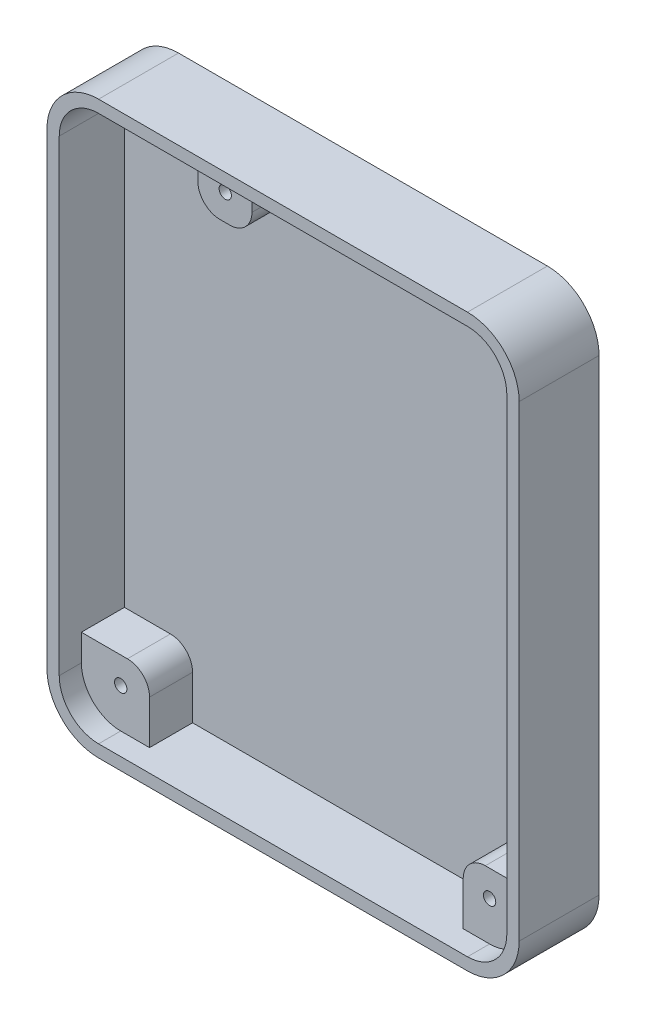
ISO-10303-21;
HEADER;
FILE_DESCRIPTION(('STEP AP214'),'2;1');
FILE_NAME('part.step','',(''),(''),'','','');
FILE_SCHEMA(('AUTOMOTIVE_DESIGN { 1 0 10303 214 1 1 1 1 }'));
ENDSEC;
DATA;
#1=APPLICATION_CONTEXT('core data for automotive mechanical design processes');
#2=APPLICATION_PROTOCOL_DEFINITION('international standard','automotive_design',2000,#1);
#3=PRODUCT_CONTEXT('',#1,'mechanical');
#4=PRODUCT('Part','Part','',(#3));
#5=PRODUCT_RELATED_PRODUCT_CATEGORY('part','',(#4));
#6=PRODUCT_DEFINITION_FORMATION('','',#4);
#7=PRODUCT_DEFINITION_CONTEXT('part definition',#1,'design');
#8=PRODUCT_DEFINITION('design','',#6,#7);
#9=PRODUCT_DEFINITION_SHAPE('','',#8);
#10=(LENGTH_UNIT() NAMED_UNIT(*) SI_UNIT(.MILLI.,.METRE.));
#11=(NAMED_UNIT(*) PLANE_ANGLE_UNIT() SI_UNIT($,.RADIAN.));
#12=(NAMED_UNIT(*) SI_UNIT($,.STERADIAN.) SOLID_ANGLE_UNIT());
#13=UNCERTAINTY_MEASURE_WITH_UNIT(LENGTH_MEASURE(1.E-05),#10,'distance_accuracy_value','');
#14=(GEOMETRIC_REPRESENTATION_CONTEXT(3) GLOBAL_UNCERTAINTY_ASSIGNED_CONTEXT((#13)) GLOBAL_UNIT_ASSIGNED_CONTEXT((#10,
#11,#12)) REPRESENTATION_CONTEXT('',''));
#15=CARTESIAN_POINT('',(0.,0.,0.));
#16=DIRECTION('',(0.,0.,1.));
#17=DIRECTION('',(1.,0.,0.));
#18=AXIS2_PLACEMENT_3D('',#15,#16,#17);
#19=CARTESIAN_POINT('',(3.00000178933324,44.2000008999999,6.5));
#20=DIRECTION('',(0.,-1.,0.));
#21=DIRECTION('',(1.,0.,0.));
#22=AXIS2_PLACEMENT_3D('',#19,#20,#21);
#23=PLANE('',#22);
#24=DIRECTION('',(-1.,0.,0.));
#25=VECTOR('',#24,1.);
#26=CARTESIAN_POINT('',(3.00000178933324,44.2000008999999,1.2));
#27=LINE('',#26,#25);
#28=CARTESIAN_POINT('',(9.27121903146132,44.2000009000005,1.2));
#29=VERTEX_POINT('',#28);
#30=CARTESIAN_POINT('',(3.00000178933324,44.2000008999999,1.2));
#31=VERTEX_POINT('',#30);
#32=EDGE_CURVE('E333',#29,#31,#27,.T.);
#33=ORIENTED_EDGE('',*,*,#32,.F.);
#34=DIRECTION('',(0.,0.,-1.));
#35=VECTOR('',#34,1.);
#36=CARTESIAN_POINT('',(9.27121903146132,44.2000009000005,4.7));
#37=LINE('',#36,#35);
#38=CARTESIAN_POINT('',(9.27121903146132,44.2000009000005,4.7));
#39=VERTEX_POINT('',#38);
#40=EDGE_CURVE('E552',#39,#29,#37,.T.);
#41=ORIENTED_EDGE('',*,*,#40,.F.);
#42=DIRECTION('',(-1.,0.,0.));
#43=VECTOR('',#42,1.);
#44=CARTESIAN_POINT('',(9.27121903146132,44.2000009000005,4.7));
#45=LINE('',#44,#43);
#46=CARTESIAN_POINT('',(13.6696035758649,44.2000009000005,4.7));
#47=VERTEX_POINT('',#46);
#48=EDGE_CURVE('E550',#47,#39,#45,.T.);
#49=ORIENTED_EDGE('',*,*,#48,.F.);
#50=DIRECTION('',(0.,0.,-1.));
#51=VECTOR('',#50,1.);
#52=CARTESIAN_POINT('',(13.6696035758649,44.2000009000005,4.7));
#53=LINE('',#52,#51);
#54=CARTESIAN_POINT('',(13.6696035758649,44.2000009000005,1.2));
#55=VERTEX_POINT('',#54);
#56=EDGE_CURVE('E564',#47,#55,#53,.T.);
#57=ORIENTED_EDGE('',*,*,#56,.T.);
#58=CARTESIAN_POINT('',(33.00000004,44.2000009000005,1.2));
#59=VERTEX_POINT('',#58);
#60=EDGE_CURVE('E334',#59,#55,#27,.T.);
#61=ORIENTED_EDGE('',*,*,#60,.F.);
#62=DIRECTION('',(0.,0.,-1.));
#63=VECTOR('',#62,1.);
#64=CARTESIAN_POINT('',(33.00000004,44.2000009000005,6.5));
#65=LINE('',#64,#63);
#66=CARTESIAN_POINT('',(33.00000004,44.2000009000005,6.5));
#67=VERTEX_POINT('',#66);
#68=EDGE_CURVE('E264',#67,#59,#65,.T.);
#69=ORIENTED_EDGE('',*,*,#68,.F.);
#70=DIRECTION('',(-1.,0.,0.));
#71=VECTOR('',#70,1.);
#72=CARTESIAN_POINT('',(3.00000178933324,44.2000008999999,6.5));
#73=LINE('',#72,#71);
#74=CARTESIAN_POINT('',(3.00000178933324,44.2000008999999,6.5));
#75=VERTEX_POINT('',#74);
#76=EDGE_CURVE('E484',#67,#75,#73,.T.);
#77=ORIENTED_EDGE('',*,*,#76,.T.);
#78=DIRECTION('',(0.,0.,-1.));
#79=VECTOR('',#78,1.);
#80=CARTESIAN_POINT('',(3.00000178933324,44.2000008999999,6.5));
#81=LINE('',#80,#79);
#82=EDGE_CURVE('E486',#75,#31,#81,.T.);
#83=ORIENTED_EDGE('',*,*,#82,.T.);
#84=EDGE_LOOP('',(#33,#41,#49,#57,#61,#69,#77,#83));
#85=FACE_BOUND('',#84,.T.);
#86=ADVANCED_FACE('F33',(#85),#23,.T.);
#87=CARTESIAN_POINT('',(2.99999908,40.99999928,6.5));
#88=DIRECTION('',(0.,0.,1.));
#89=DIRECTION('',(1.,0.,0.));
#90=AXIS2_PLACEMENT_3D('',#87,#88,#89);
#91=PLANE('',#90);
#92=CARTESIAN_POINT('',(2.99999908,40.99999928,6.5));
#93=DIRECTION('',(0.,0.,1.));
#94=DIRECTION('',(1.,0.,0.));
#95=AXIS2_PLACEMENT_3D('',#92,#93,#94);
#96=CIRCLE('',#95,4.2000016200008);
#97=CARTESIAN_POINT('',(3.00000178933324,45.2000008999999,6.5));
#98=VERTEX_POINT('',#97);
#99=CARTESIAN_POINT('',(-1.20000253999993,40.9999965706668,6.5));
#100=VERTEX_POINT('',#99);
#101=EDGE_CURVE('E277',#98,#100,#96,.T.);
#102=ORIENTED_EDGE('',*,*,#101,.T.);
#103=DIRECTION('',(0.,-1.,0.));
#104=VECTOR('',#103,1.);
#105=CARTESIAN_POINT('',(-1.20000253999993,40.9999965706668,6.5));
#106=LINE('',#105,#104);
#107=CARTESIAN_POINT('',(-1.20000253999974,3.00000517599945,6.5));
#108=VERTEX_POINT('',#107);
#109=EDGE_CURVE('E280',#100,#108,#106,.T.);
#110=ORIENTED_EDGE('',*,*,#109,.T.);
#111=CARTESIAN_POINT('',(2.99999908,3.00000162,6.5));
#112=DIRECTION('',(0.,0.,1.));
#113=DIRECTION('',(1.,0.,0.));
#114=AXIS2_PLACEMENT_3D('',#111,#112,#113);
#115=CIRCLE('',#114,4.20000162000124);
#116=CARTESIAN_POINT('',(3.00000178933324,-1.20000000000054,6.5));
#117=VERTEX_POINT('',#116);
#118=EDGE_CURVE('E283',#108,#117,#115,.T.);
#119=ORIENTED_EDGE('',*,*,#118,.T.);
#120=DIRECTION('',(1.,0.,0.));
#121=VECTOR('',#120,1.);
#122=CARTESIAN_POINT('',(3.00000178933324,-1.20000000000054,6.5));
#123=LINE('',#122,#121);
#124=CARTESIAN_POINT('',(33.00000004,-1.2000000000004,6.5));
#125=VERTEX_POINT('',#124);
#126=EDGE_CURVE('E285',#117,#125,#123,.T.);
#127=ORIENTED_EDGE('',*,*,#126,.T.);
#128=CARTESIAN_POINT('',(33.00000004,3.00000162,6.5));
#129=DIRECTION('',(0.,0.,1.));
#130=DIRECTION('',(1.,0.,0.));
#131=AXIS2_PLACEMENT_3D('',#128,#129,#130);
#132=CIRCLE('',#131,4.2000016200004);
#133=CARTESIAN_POINT('',(37.2000016599994,3.00000432933324,6.5));
#134=VERTEX_POINT('',#133);
#135=EDGE_CURVE('E287',#125,#134,#132,.T.);
#136=ORIENTED_EDGE('',*,*,#135,.T.);
#137=DIRECTION('',(0.,1.,0.));
#138=VECTOR('',#137,1.);
#139=CARTESIAN_POINT('',(37.200001659999,40.9999957240005,6.5));
#140=LINE('',#139,#138);
#141=CARTESIAN_POINT('',(37.2000016599987,40.9999957240005,6.5));
#142=VERTEX_POINT('',#141);
#143=EDGE_CURVE('E289',#134,#142,#140,.T.);
#144=ORIENTED_EDGE('',*,*,#143,.T.);
#145=CARTESIAN_POINT('',(33.00000004,40.99999928,6.5));
#146=DIRECTION('',(0.,0.,1.));
#147=DIRECTION('',(1.,0.,0.));
#148=AXIS2_PLACEMENT_3D('',#145,#146,#147);
#149=CIRCLE('',#148,4.20000162000023);
#150=CARTESIAN_POINT('',(33.00000004,45.2000008999999,6.5));
#151=VERTEX_POINT('',#150);
#152=EDGE_CURVE('E291',#142,#151,#149,.T.);
#153=ORIENTED_EDGE('',*,*,#152,.T.);
#154=DIRECTION('',(-1.,0.,0.));
#155=VECTOR('',#154,1.);
#156=CARTESIAN_POINT('',(3.00000178933324,45.2000008999999,6.5));
#157=LINE('',#156,#155);
#158=EDGE_CURVE('E293',#151,#98,#157,.T.);
#159=ORIENTED_EDGE('',*,*,#158,.T.);
#160=EDGE_LOOP('',(#102,#110,#119,#127,#136,#144,#153,#159));
#161=FACE_BOUND('',#160,.T.);
#162=DIRECTION('',(0.,-1.,0.));
#163=VECTOR('',#162,1.);
#164=CARTESIAN_POINT('',(-0.200002539999926,40.9999965706668,6.5));
#165=LINE('',#164,#163);
#166=CARTESIAN_POINT('',(-0.200002539999926,40.9999965706668,6.5));
#167=VERTEX_POINT('',#166);
#168=CARTESIAN_POINT('',(-0.200002539999929,3.00000432933324,6.5));
#169=VERTEX_POINT('',#168);
#170=EDGE_CURVE('E463',#167,#169,#165,.T.);
#171=ORIENTED_EDGE('',*,*,#170,.F.);
#172=CARTESIAN_POINT('',(2.99999908,40.99999928,6.5));
#173=DIRECTION('',(0.,0.,1.));
#174=DIRECTION('',(1.,0.,0.));
#175=AXIS2_PLACEMENT_3D('',#172,#173,#174);
#176=CIRCLE('',#175,3.20000162000107);
#177=EDGE_CURVE('E465',#75,#167,#176,.T.);
#178=ORIENTED_EDGE('',*,*,#177,.F.);
#179=ORIENTED_EDGE('',*,*,#76,.F.);
#180=CARTESIAN_POINT('',(33.00000004,40.99999928,6.5));
#181=DIRECTION('',(0.,0.,1.));
#182=DIRECTION('',(1.,0.,0.));
#183=AXIS2_PLACEMENT_3D('',#180,#181,#182);
#184=CIRCLE('',#183,3.20000162000054);
#185=CARTESIAN_POINT('',(36.2000016599994,40.9999965706668,6.5));
#186=VERTEX_POINT('',#185);
#187=EDGE_CURVE('E481',#186,#67,#184,.T.);
#188=ORIENTED_EDGE('',*,*,#187,.F.);
#189=DIRECTION('',(0.,1.,0.));
#190=VECTOR('',#189,1.);
#191=CARTESIAN_POINT('',(36.2000016599994,40.9999965706668,6.5));
#192=LINE('',#191,#190);
#193=CARTESIAN_POINT('',(36.2000016599994,3.00000432933324,6.5));
#194=VERTEX_POINT('',#193);
#195=EDGE_CURVE('E479',#194,#186,#192,.T.);
#196=ORIENTED_EDGE('',*,*,#195,.F.);
#197=CARTESIAN_POINT('',(33.00000004,3.00000162,6.5));
#198=DIRECTION('',(0.,0.,1.));
#199=DIRECTION('',(1.,0.,0.));
#200=AXIS2_PLACEMENT_3D('',#197,#198,#199);
#201=CIRCLE('',#200,3.20000162000054);
#202=CARTESIAN_POINT('',(33.00000004,-0.200000000000539,6.5));
#203=VERTEX_POINT('',#202);
#204=EDGE_CURVE('E257',#203,#194,#201,.T.);
#205=ORIENTED_EDGE('',*,*,#204,.F.);
#206=DIRECTION('',(1.,0.,0.));
#207=VECTOR('',#206,1.);
#208=CARTESIAN_POINT('',(3.00000178933324,-0.199999999999929,6.5));
#209=LINE('',#208,#207);
#210=CARTESIAN_POINT('',(3.00000178933324,-0.199999999999929,6.5));
#211=VERTEX_POINT('',#210);
#212=EDGE_CURVE('E471',#211,#203,#209,.T.);
#213=ORIENTED_EDGE('',*,*,#212,.F.);
#214=CARTESIAN_POINT('',(2.99999908,3.00000162,6.5));
#215=DIRECTION('',(0.,0.,1.));
#216=DIRECTION('',(1.,0.,0.));
#217=AXIS2_PLACEMENT_3D('',#214,#215,#216);
#218=CIRCLE('',#217,3.20000162000108);
#219=EDGE_CURVE('E467',#169,#211,#218,.T.);
#220=ORIENTED_EDGE('',*,*,#219,.F.);
#221=EDGE_LOOP('',(#171,#178,#179,#188,#196,#205,#213,#220));
#222=FACE_BOUND('',#221,.T.);
#223=ADVANCED_FACE('F369',(#161,#222),#91,.T.);
#224=CARTESIAN_POINT('',(2.99999908,40.99999928,0.));
#225=DIRECTION('',(0.,0.,1.));
#226=DIRECTION('',(1.,0.,0.));
#227=AXIS2_PLACEMENT_3D('',#224,#225,#226);
#228=PLANE('',#227);
#229=CARTESIAN_POINT('',(2.99999908,40.99999928,0.));
#230=DIRECTION('',(0.,0.,1.));
#231=DIRECTION('',(1.,0.,0.));
#232=AXIS2_PLACEMENT_3D('',#229,#230,#231);
#233=CIRCLE('',#232,4.2000016200008);
#234=CARTESIAN_POINT('',(3.00000178933324,45.2000008999999,0.));
#235=VERTEX_POINT('',#234);
#236=CARTESIAN_POINT('',(-1.20000253999993,40.9999965706668,0.));
#237=VERTEX_POINT('',#236);
#238=EDGE_CURVE('E276',#235,#237,#233,.T.);
#239=ORIENTED_EDGE('',*,*,#238,.F.);
#240=DIRECTION('',(-1.,0.,0.));
#241=VECTOR('',#240,1.);
#242=CARTESIAN_POINT('',(3.00000178933324,45.2000008999999,0.));
#243=LINE('',#242,#241);
#244=CARTESIAN_POINT('',(33.00000004,45.2000008999999,0.));
#245=VERTEX_POINT('',#244);
#246=EDGE_CURVE('E281',#245,#235,#243,.T.);
#247=ORIENTED_EDGE('',*,*,#246,.F.);
#248=CARTESIAN_POINT('',(33.00000004,40.99999928,0.));
#249=DIRECTION('',(0.,0.,1.));
#250=DIRECTION('',(1.,0.,0.));
#251=AXIS2_PLACEMENT_3D('',#248,#249,#250);
#252=CIRCLE('',#251,4.20000162000023);
#253=CARTESIAN_POINT('',(37.2000016599987,40.9999957240005,0.));
#254=VERTEX_POINT('',#253);
#255=EDGE_CURVE('E313',#254,#245,#252,.T.);
#256=ORIENTED_EDGE('',*,*,#255,.F.);
#257=DIRECTION('',(0.,1.,0.));
#258=VECTOR('',#257,1.);
#259=CARTESIAN_POINT('',(37.200001659999,40.9999957240005,0.));
#260=LINE('',#259,#258);
#261=CARTESIAN_POINT('',(37.2000016599994,3.00000432933324,0.));
#262=VERTEX_POINT('',#261);
#263=EDGE_CURVE('E310',#262,#254,#260,.T.);
#264=ORIENTED_EDGE('',*,*,#263,.F.);
#265=CARTESIAN_POINT('',(33.00000004,3.00000162,0.));
#266=DIRECTION('',(0.,0.,1.));
#267=DIRECTION('',(1.,0.,0.));
#268=AXIS2_PLACEMENT_3D('',#265,#266,#267);
#269=CIRCLE('',#268,4.2000016200004);
#270=CARTESIAN_POINT('',(33.00000004,-1.2000000000004,0.));
#271=VERTEX_POINT('',#270);
#272=EDGE_CURVE('E307',#271,#262,#269,.T.);
#273=ORIENTED_EDGE('',*,*,#272,.F.);
#274=DIRECTION('',(1.,0.,0.));
#275=VECTOR('',#274,1.);
#276=CARTESIAN_POINT('',(3.00000178933324,-1.20000000000054,0.));
#277=LINE('',#276,#275);
#278=CARTESIAN_POINT('',(3.00000178933324,-1.20000000000054,0.));
#279=VERTEX_POINT('',#278);
#280=EDGE_CURVE('E304',#279,#271,#277,.T.);
#281=ORIENTED_EDGE('',*,*,#280,.F.);
#282=CARTESIAN_POINT('',(2.99999908,3.00000162,0.));
#283=DIRECTION('',(0.,0.,1.));
#284=DIRECTION('',(1.,0.,0.));
#285=AXIS2_PLACEMENT_3D('',#282,#283,#284);
#286=CIRCLE('',#285,4.20000162000124);
#287=CARTESIAN_POINT('',(-1.20000253999974,3.00000517599945,0.));
#288=VERTEX_POINT('',#287);
#289=EDGE_CURVE('E301',#288,#279,#286,.T.);
#290=ORIENTED_EDGE('',*,*,#289,.F.);
#291=DIRECTION('',(0.,-1.,0.));
#292=VECTOR('',#291,1.);
#293=CARTESIAN_POINT('',(-1.20000253999993,40.9999965706668,0.));
#294=LINE('',#293,#292);
#295=EDGE_CURVE('E298',#237,#288,#294,.T.);
#296=ORIENTED_EDGE('',*,*,#295,.F.);
#297=EDGE_LOOP('',(#239,#247,#256,#264,#273,#281,#290,#296));
#298=FACE_BOUND('',#297,.T.);
#299=ADVANCED_FACE('F374',(#298),#228,.F.);
#300=CARTESIAN_POINT('',(2.99999908,40.99999928,6.5));
#301=DIRECTION('',(0.,0.,-1.));
#302=DIRECTION('',(-1.,0.,0.));
#303=AXIS2_PLACEMENT_3D('',#300,#301,#302);
#304=CYLINDRICAL_SURFACE('',#303,4.2000016200008);
#305=DIRECTION('',(0.,0.,-1.));
#306=VECTOR('',#305,1.);
#307=CARTESIAN_POINT('',(3.00000178933324,45.2000008999999,6.5));
#308=LINE('',#307,#306);
#309=EDGE_CURVE('E295',#98,#235,#308,.T.);
#310=ORIENTED_EDGE('',*,*,#309,.T.);
#311=ORIENTED_EDGE('',*,*,#238,.T.);
#312=DIRECTION('',(0.,0.,-1.));
#313=VECTOR('',#312,1.);
#314=CARTESIAN_POINT('',(-1.20000253999993,40.9999965706668,6.5));
#315=LINE('',#314,#313);
#316=EDGE_CURVE('E331',#100,#237,#315,.T.);
#317=ORIENTED_EDGE('',*,*,#316,.F.);
#318=ORIENTED_EDGE('',*,*,#101,.F.);
#319=EDGE_LOOP('',(#310,#311,#317,#318));
#320=FACE_BOUND('',#319,.T.);
#321=ADVANCED_FACE('F35',(#320),#304,.T.);
#322=CARTESIAN_POINT('',(-1.20000253999993,40.9999965706668,6.5));
#323=DIRECTION('',(1.,0.,0.));
#324=DIRECTION('',(0.,1.,0.));
#325=AXIS2_PLACEMENT_3D('',#322,#323,#324);
#326=PLANE('',#325);
#327=ORIENTED_EDGE('',*,*,#316,.T.);
#328=ORIENTED_EDGE('',*,*,#295,.T.);
#329=DIRECTION('',(0.,0.,-1.));
#330=VECTOR('',#329,1.);
#331=CARTESIAN_POINT('',(-1.20000253999974,3.00000517599945,6.5));
#332=LINE('',#331,#330);
#333=EDGE_CURVE('E329',#108,#288,#332,.T.);
#334=ORIENTED_EDGE('',*,*,#333,.F.);
#335=ORIENTED_EDGE('',*,*,#109,.F.);
#336=EDGE_LOOP('',(#327,#328,#334,#335));
#337=FACE_BOUND('',#336,.T.);
#338=ADVANCED_FACE('F428',(#337),#326,.F.);
#339=CARTESIAN_POINT('',(2.99999908,3.00000162,6.5));
#340=DIRECTION('',(0.,0.,-1.));
#341=DIRECTION('',(-1.,0.,0.));
#342=AXIS2_PLACEMENT_3D('',#339,#340,#341);
#343=CYLINDRICAL_SURFACE('',#342,4.20000162000124);
#344=ORIENTED_EDGE('',*,*,#333,.T.);
#345=ORIENTED_EDGE('',*,*,#289,.T.);
#346=DIRECTION('',(0.,0.,-1.));
#347=VECTOR('',#346,1.);
#348=CARTESIAN_POINT('',(3.00000178933324,-1.20000000000054,6.5));
#349=LINE('',#348,#347);
#350=EDGE_CURVE('E327',#117,#279,#349,.T.);
#351=ORIENTED_EDGE('',*,*,#350,.F.);
#352=ORIENTED_EDGE('',*,*,#118,.F.);
#353=EDGE_LOOP('',(#344,#345,#351,#352));
#354=FACE_BOUND('',#353,.T.);
#355=ADVANCED_FACE('F425',(#354),#343,.T.);
#356=CARTESIAN_POINT('',(3.00000178933324,-1.20000000000054,6.5));
#357=DIRECTION('',(0.,1.,0.));
#358=DIRECTION('',(-1.,0.,0.));
#359=AXIS2_PLACEMENT_3D('',#356,#357,#358);
#360=PLANE('',#359);
#361=ORIENTED_EDGE('',*,*,#350,.T.);
#362=ORIENTED_EDGE('',*,*,#280,.T.);
#363=DIRECTION('',(0.,0.,-1.));
#364=VECTOR('',#363,1.);
#365=CARTESIAN_POINT('',(33.00000004,-1.2000000000004,6.5));
#366=LINE('',#365,#364);
#367=EDGE_CURVE('E325',#125,#271,#366,.T.);
#368=ORIENTED_EDGE('',*,*,#367,.F.);
#369=ORIENTED_EDGE('',*,*,#126,.F.);
#370=EDGE_LOOP('',(#361,#362,#368,#369));
#371=FACE_BOUND('',#370,.T.);
#372=ADVANCED_FACE('F421',(#371),#360,.F.);
#373=CARTESIAN_POINT('',(33.00000004,3.00000162,6.5));
#374=DIRECTION('',(0.,0.,-1.));
#375=DIRECTION('',(-1.,0.,0.));
#376=AXIS2_PLACEMENT_3D('',#373,#374,#375);
#377=CYLINDRICAL_SURFACE('',#376,4.2000016200004);
#378=ORIENTED_EDGE('',*,*,#367,.T.);
#379=ORIENTED_EDGE('',*,*,#272,.T.);
#380=DIRECTION('',(0.,0.,-1.));
#381=VECTOR('',#380,1.);
#382=CARTESIAN_POINT('',(37.2000016599994,3.00000432933324,6.5));
#383=LINE('',#382,#381);
#384=EDGE_CURVE('E323',#134,#262,#383,.T.);
#385=ORIENTED_EDGE('',*,*,#384,.F.);
#386=ORIENTED_EDGE('',*,*,#135,.F.);
#387=EDGE_LOOP('',(#378,#379,#385,#386));
#388=FACE_BOUND('',#387,.T.);
#389=ADVANCED_FACE('F417',(#388),#377,.T.);
#390=CARTESIAN_POINT('',(37.200001659999,40.9999957240005,6.5));
#391=DIRECTION('',(-1.,0.,0.));
#392=DIRECTION('',(0.,-1.,0.));
#393=AXIS2_PLACEMENT_3D('',#390,#391,#392);
#394=PLANE('',#393);
#395=ORIENTED_EDGE('',*,*,#384,.T.);
#396=ORIENTED_EDGE('',*,*,#263,.T.);
#397=DIRECTION('',(0.,0.,-1.));
#398=VECTOR('',#397,1.);
#399=CARTESIAN_POINT('',(37.2000016599987,40.9999957240005,6.5));
#400=LINE('',#399,#398);
#401=EDGE_CURVE('E321',#142,#254,#400,.T.);
#402=ORIENTED_EDGE('',*,*,#401,.F.);
#403=ORIENTED_EDGE('',*,*,#143,.F.);
#404=EDGE_LOOP('',(#395,#396,#402,#403));
#405=FACE_BOUND('',#404,.T.);
#406=ADVANCED_FACE('F413',(#405),#394,.F.);
#407=CARTESIAN_POINT('',(33.00000004,40.99999928,6.5));
#408=DIRECTION('',(0.,0.,-1.));
#409=DIRECTION('',(-1.,0.,0.));
#410=AXIS2_PLACEMENT_3D('',#407,#408,#409);
#411=CYLINDRICAL_SURFACE('',#410,4.20000162000023);
#412=ORIENTED_EDGE('',*,*,#401,.T.);
#413=ORIENTED_EDGE('',*,*,#255,.T.);
#414=DIRECTION('',(0.,0.,-1.));
#415=VECTOR('',#414,1.);
#416=CARTESIAN_POINT('',(33.00000004,45.2000008999999,6.5));
#417=LINE('',#416,#415);
#418=EDGE_CURVE('E319',#151,#245,#417,.T.);
#419=ORIENTED_EDGE('',*,*,#418,.F.);
#420=ORIENTED_EDGE('',*,*,#152,.F.);
#421=EDGE_LOOP('',(#412,#413,#419,#420));
#422=FACE_BOUND('',#421,.T.);
#423=ADVANCED_FACE('F409',(#422),#411,.T.);
#424=CARTESIAN_POINT('',(3.00000178933324,45.2000008999999,6.5));
#425=DIRECTION('',(0.,-1.,0.));
#426=DIRECTION('',(0.,0.,-1.));
#427=AXIS2_PLACEMENT_3D('',#424,#425,#426);
#428=PLANE('',#427);
#429=ORIENTED_EDGE('',*,*,#418,.T.);
#430=ORIENTED_EDGE('',*,*,#246,.T.);
#431=ORIENTED_EDGE('',*,*,#309,.F.);
#432=ORIENTED_EDGE('',*,*,#158,.F.);
#433=EDGE_LOOP('',(#429,#430,#431,#432));
#434=FACE_BOUND('',#433,.T.);
#435=ADVANCED_FACE('F401',(#434),#428,.F.);
#436=CARTESIAN_POINT('',(2.99999908,40.99999928,6.5));
#437=DIRECTION('',(0.,0.,-1.));
#438=DIRECTION('',(-1.,0.,0.));
#439=AXIS2_PLACEMENT_3D('',#436,#437,#438);
#440=CYLINDRICAL_SURFACE('',#439,3.20000162000107);
#441=CARTESIAN_POINT('',(2.99999908,40.99999928,1.2));
#442=DIRECTION('',(0.,0.,1.));
#443=DIRECTION('',(1.,0.,0.));
#444=AXIS2_PLACEMENT_3D('',#441,#442,#443);
#445=CIRCLE('',#444,3.20000162000107);
#446=CARTESIAN_POINT('',(-0.200002539999926,40.9999965706668,1.2));
#447=VERTEX_POINT('',#446);
#448=EDGE_CURVE('E473',#31,#447,#445,.T.);
#449=ORIENTED_EDGE('',*,*,#448,.F.);
#450=ORIENTED_EDGE('',*,*,#82,.F.);
#451=ORIENTED_EDGE('',*,*,#177,.T.);
#452=DIRECTION('',(0.,0.,-1.));
#453=VECTOR('',#452,1.);
#454=CARTESIAN_POINT('',(-0.200002539999926,40.9999965706668,6.5));
#455=LINE('',#454,#453);
#456=EDGE_CURVE('E273',#167,#447,#455,.T.);
#457=ORIENTED_EDGE('',*,*,#456,.T.);
#458=EDGE_LOOP('',(#449,#450,#451,#457));
#459=FACE_BOUND('',#458,.T.);
#460=ADVANCED_FACE('F398',(#459),#440,.F.);
#461=CARTESIAN_POINT('',(-0.200002539999926,40.9999965706668,6.5));
#462=DIRECTION('',(1.,0.,0.));
#463=DIRECTION('',(0.,1.,0.));
#464=AXIS2_PLACEMENT_3D('',#461,#462,#463);
#465=PLANE('',#464);
#466=DIRECTION('',(0.,-1.,0.));
#467=VECTOR('',#466,1.);
#468=CARTESIAN_POINT('',(-0.200002539999929,3.00000432933324,4.7));
#469=LINE('',#468,#467);
#470=CARTESIAN_POINT('',(-0.200002539999929,5.15812606619917,4.7));
#471=VERTEX_POINT('',#470);
#472=CARTESIAN_POINT('',(-0.200002539999929,3.00000432933324,4.7));
#473=VERTEX_POINT('',#472);
#474=EDGE_CURVE('E520',#471,#473,#469,.T.);
#475=ORIENTED_EDGE('',*,*,#474,.F.);
#476=DIRECTION('',(0.,0.,-1.));
#477=VECTOR('',#476,1.);
#478=CARTESIAN_POINT('',(-0.200002539999929,5.15812606619917,4.7));
#479=LINE('',#478,#477);
#480=CARTESIAN_POINT('',(-0.200002539999929,5.15812606619917,1.2));
#481=VERTEX_POINT('',#480);
#482=EDGE_CURVE('E519',#471,#481,#479,.T.);
#483=ORIENTED_EDGE('',*,*,#482,.T.);
#484=DIRECTION('',(0.,-1.,0.));
#485=VECTOR('',#484,1.);
#486=CARTESIAN_POINT('',(-0.200002539999926,40.9999965706668,1.2));
#487=LINE('',#486,#485);
#488=EDGE_CURVE('E509',#447,#481,#487,.T.);
#489=ORIENTED_EDGE('',*,*,#488,.F.);
#490=ORIENTED_EDGE('',*,*,#456,.F.);
#491=ORIENTED_EDGE('',*,*,#170,.T.);
#492=DIRECTION('',(0.,0.,-1.));
#493=VECTOR('',#492,1.);
#494=CARTESIAN_POINT('',(-0.200002539999929,3.00000432933324,6.5));
#495=LINE('',#494,#493);
#496=EDGE_CURVE('E270',#169,#473,#495,.T.);
#497=ORIENTED_EDGE('',*,*,#496,.T.);
#498=EDGE_LOOP('',(#475,#483,#489,#490,#491,#497));
#499=FACE_BOUND('',#498,.T.);
#500=ADVANCED_FACE('F394',(#499),#465,.T.);
#501=CARTESIAN_POINT('',(2.99999908,3.00000162,6.5));
#502=DIRECTION('',(0.,0.,-1.));
#503=DIRECTION('',(-1.,0.,0.));
#504=AXIS2_PLACEMENT_3D('',#501,#502,#503);
#505=CYLINDRICAL_SURFACE('',#504,3.20000162000108);
#506=CARTESIAN_POINT('',(2.99999908,3.00000162,4.7));
#507=DIRECTION('',(0.,0.,1.));
#508=DIRECTION('',(1.,0.,0.));
#509=AXIS2_PLACEMENT_3D('',#506,#507,#508);
#510=CIRCLE('',#509,3.20000162000108);
#511=CARTESIAN_POINT('',(3.00000178933324,-0.199999999999929,4.7));
#512=VERTEX_POINT('',#511);
#513=EDGE_CURVE('E602',#473,#512,#510,.T.);
#514=ORIENTED_EDGE('',*,*,#513,.F.);
#515=ORIENTED_EDGE('',*,*,#496,.F.);
#516=ORIENTED_EDGE('',*,*,#219,.T.);
#517=DIRECTION('',(0.,0.,-1.));
#518=VECTOR('',#517,1.);
#519=CARTESIAN_POINT('',(3.00000178933324,-0.199999999999929,6.5));
#520=LINE('',#519,#518);
#521=EDGE_CURVE('E261',#211,#512,#520,.T.);
#522=ORIENTED_EDGE('',*,*,#521,.T.);
#523=EDGE_LOOP('',(#514,#515,#516,#522));
#524=FACE_BOUND('',#523,.T.);
#525=ADVANCED_FACE('F390',(#524),#505,.F.);
#526=CARTESIAN_POINT('',(3.00000178933324,-0.199999999999929,6.5));
#527=DIRECTION('',(0.,1.,0.));
#528=DIRECTION('',(-1.,0.,0.));
#529=AXIS2_PLACEMENT_3D('',#526,#527,#528);
#530=PLANE('',#529);
#531=DIRECTION('',(1.,-2.83830410519163E-13,0.));
#532=VECTOR('',#531,1.);
#533=CARTESIAN_POINT('',(33.00000004,-0.200000000000539,4.7));
#534=LINE('',#533,#532);
#535=CARTESIAN_POINT('',(30.8511184912748,-0.199999999999929,4.7));
#536=VERTEX_POINT('',#535);
#537=CARTESIAN_POINT('',(33.00000004,-0.200000000000539,4.7));
#538=VERTEX_POINT('',#537);
#539=EDGE_CURVE('E238',#536,#538,#534,.T.);
#540=ORIENTED_EDGE('',*,*,#539,.F.);
#541=DIRECTION('',(0.,0.,-1.));
#542=VECTOR('',#541,1.);
#543=CARTESIAN_POINT('',(30.8511184912748,-0.199999999999929,4.7));
#544=LINE('',#543,#542);
#545=CARTESIAN_POINT('',(30.8511184912748,-0.199999999999929,1.2));
#546=VERTEX_POINT('',#545);
#547=EDGE_CURVE('E909',#536,#546,#544,.T.);
#548=ORIENTED_EDGE('',*,*,#547,.T.);
#549=DIRECTION('',(1.,0.,0.));
#550=VECTOR('',#549,1.);
#551=CARTESIAN_POINT('',(3.00000178933324,-0.199999999999929,1.2));
#552=LINE('',#551,#550);
#553=CARTESIAN_POINT('',(5.34207192778054,-0.199999999999929,1.2));
#554=VERTEX_POINT('',#553);
#555=EDGE_CURVE('E501',#554,#546,#552,.T.);
#556=ORIENTED_EDGE('',*,*,#555,.F.);
#557=DIRECTION('',(0.,0.,-1.));
#558=VECTOR('',#557,1.);
#559=CARTESIAN_POINT('',(5.34207192778054,-0.199999999999929,4.7));
#560=LINE('',#559,#558);
#561=CARTESIAN_POINT('',(5.34207192778054,-0.199999999999929,4.7));
#562=VERTEX_POINT('',#561);
#563=EDGE_CURVE('E532',#562,#554,#560,.T.);
#564=ORIENTED_EDGE('',*,*,#563,.F.);
#565=DIRECTION('',(1.,0.,0.));
#566=VECTOR('',#565,1.);
#567=CARTESIAN_POINT('',(5.34207192778054,-0.199999999999929,4.7));
#568=LINE('',#567,#566);
#569=EDGE_CURVE('E600',#512,#562,#568,.T.);
#570=ORIENTED_EDGE('',*,*,#569,.F.);
#571=ORIENTED_EDGE('',*,*,#521,.F.);
#572=ORIENTED_EDGE('',*,*,#212,.T.);
#573=DIRECTION('',(0.,0.,-1.));
#574=VECTOR('',#573,1.);
#575=CARTESIAN_POINT('',(33.00000004,-0.200000000000539,6.5));
#576=LINE('',#575,#574);
#577=EDGE_CURVE('E258',#203,#538,#576,.T.);
#578=ORIENTED_EDGE('',*,*,#577,.T.);
#579=EDGE_LOOP('',(#540,#548,#556,#564,#570,#571,#572,#578));
#580=FACE_BOUND('',#579,.T.);
#581=ADVANCED_FACE('F387',(#580),#530,.T.);
#582=CARTESIAN_POINT('',(33.00000004,3.00000162,6.5));
#583=DIRECTION('',(0.,0.,-1.));
#584=DIRECTION('',(-1.,0.,0.));
#585=AXIS2_PLACEMENT_3D('',#582,#583,#584);
#586=CYLINDRICAL_SURFACE('',#585,3.20000162000054);
#587=CARTESIAN_POINT('',(33.00000004,3.00000162,4.7));
#588=DIRECTION('',(0.,0.,1.));
#589=DIRECTION('',(1.,0.,0.));
#590=AXIS2_PLACEMENT_3D('',#587,#588,#589);
#591=CIRCLE('',#590,3.20000162000054);
#592=CARTESIAN_POINT('',(36.2000016599994,3.00000432933324,4.7));
#593=VERTEX_POINT('',#592);
#594=EDGE_CURVE('E231',#538,#593,#591,.T.);
#595=ORIENTED_EDGE('',*,*,#594,.F.);
#596=ORIENTED_EDGE('',*,*,#577,.F.);
#597=ORIENTED_EDGE('',*,*,#204,.T.);
#598=DIRECTION('',(0.,0.,-1.));
#599=VECTOR('',#598,1.);
#600=CARTESIAN_POINT('',(36.2000016599994,3.00000432933324,6.5));
#601=LINE('',#600,#599);
#602=EDGE_CURVE('E249',#194,#593,#601,.T.);
#603=ORIENTED_EDGE('',*,*,#602,.T.);
#604=EDGE_LOOP('',(#595,#596,#597,#603));
#605=FACE_BOUND('',#604,.T.);
#606=ADVANCED_FACE('F255',(#605),#586,.F.);
#607=CARTESIAN_POINT('',(36.2000016599994,40.9999965706668,6.5));
#608=DIRECTION('',(-1.,0.,0.));
#609=DIRECTION('',(0.,0.,1.));
#610=AXIS2_PLACEMENT_3D('',#607,#608,#609);
#611=PLANE('',#610);
#612=DIRECTION('',(0.,1.,0.));
#613=VECTOR('',#612,1.);
#614=CARTESIAN_POINT('',(36.2000016599994,5.13736836749542,4.7));
#615=LINE('',#614,#613);
#616=CARTESIAN_POINT('',(36.2000016599994,5.13736836749542,4.7));
#617=VERTEX_POINT('',#616);
#618=EDGE_CURVE('E235',#593,#617,#615,.T.);
#619=ORIENTED_EDGE('',*,*,#618,.F.);
#620=ORIENTED_EDGE('',*,*,#602,.F.);
#621=ORIENTED_EDGE('',*,*,#195,.T.);
#622=DIRECTION('',(0.,0.,-1.));
#623=VECTOR('',#622,1.);
#624=CARTESIAN_POINT('',(36.2000016599994,40.9999965706668,6.5));
#625=LINE('',#624,#623);
#626=CARTESIAN_POINT('',(36.2000016599994,40.9999965706668,1.2));
#627=VERTEX_POINT('',#626);
#628=EDGE_CURVE('E259',#186,#627,#625,.T.);
#629=ORIENTED_EDGE('',*,*,#628,.T.);
#630=DIRECTION('',(0.,1.,0.));
#631=VECTOR('',#630,1.);
#632=CARTESIAN_POINT('',(36.2000016599994,40.9999965706668,1.2));
#633=LINE('',#632,#631);
#634=CARTESIAN_POINT('',(36.2000016599994,5.13736836749542,1.2));
#635=VERTEX_POINT('',#634);
#636=EDGE_CURVE('E498',#635,#627,#633,.T.);
#637=ORIENTED_EDGE('',*,*,#636,.F.);
#638=DIRECTION('',(0.,0.,-1.));
#639=VECTOR('',#638,1.);
#640=CARTESIAN_POINT('',(36.2000016599994,5.13736836749542,4.7));
#641=LINE('',#640,#639);
#642=EDGE_CURVE('E252',#617,#635,#641,.T.);
#643=ORIENTED_EDGE('',*,*,#642,.F.);
#644=EDGE_LOOP('',(#619,#620,#621,#629,#637,#643));
#645=FACE_BOUND('',#644,.T.);
#646=ADVANCED_FACE('F248',(#645),#611,.T.);
#647=CARTESIAN_POINT('',(33.00000004,40.99999928,6.5));
#648=DIRECTION('',(0.,0.,-1.));
#649=DIRECTION('',(-1.,0.,0.));
#650=AXIS2_PLACEMENT_3D('',#647,#648,#649);
#651=CYLINDRICAL_SURFACE('',#650,3.20000162000054);
#652=CARTESIAN_POINT('',(33.00000004,40.99999928,1.2));
#653=DIRECTION('',(0.,0.,1.));
#654=DIRECTION('',(1.,0.,0.));
#655=AXIS2_PLACEMENT_3D('',#652,#653,#654);
#656=CIRCLE('',#655,3.20000162000054);
#657=EDGE_CURVE('E492',#627,#59,#656,.T.);
#658=ORIENTED_EDGE('',*,*,#657,.F.);
#659=ORIENTED_EDGE('',*,*,#628,.F.);
#660=ORIENTED_EDGE('',*,*,#187,.T.);
#661=ORIENTED_EDGE('',*,*,#68,.T.);
#662=EDGE_LOOP('',(#658,#659,#660,#661));
#663=FACE_BOUND('',#662,.T.);
#664=ADVANCED_FACE('F379',(#663),#651,.F.);
#665=CARTESIAN_POINT('',(2.99999908,40.99999928,1.2));
#666=DIRECTION('',(0.,0.,1.));
#667=DIRECTION('',(1.,0.,0.));
#668=AXIS2_PLACEMENT_3D('',#665,#666,#667);
#669=PLANE('',#668);
#670=CARTESIAN_POINT('',(32.6511184912748,3.33736836749542,1.2));
#671=DIRECTION('',(0.,0.,1.));
#672=DIRECTION('',(-1.,0.,0.));
#673=AXIS2_PLACEMENT_3D('',#670,#671,#672);
#674=CIRCLE('',#673,1.8);
#675=CARTESIAN_POINT('',(32.6511184912748,5.13736836749542,1.2));
#676=VERTEX_POINT('',#675);
#677=CARTESIAN_POINT('',(30.8511184912748,3.33736836749542,1.2));
#678=VERTEX_POINT('',#677);
#679=EDGE_CURVE('E901',#676,#678,#674,.T.);
#680=ORIENTED_EDGE('',*,*,#679,.F.);
#681=DIRECTION('',(-1.,0.,0.));
#682=VECTOR('',#681,1.);
#683=CARTESIAN_POINT('',(32.6511184912748,5.13736836749542,1.2));
#684=LINE('',#683,#682);
#685=EDGE_CURVE('E899',#635,#676,#684,.T.);
#686=ORIENTED_EDGE('',*,*,#685,.F.);
#687=ORIENTED_EDGE('',*,*,#636,.T.);
#688=ORIENTED_EDGE('',*,*,#657,.T.);
#689=ORIENTED_EDGE('',*,*,#60,.T.);
#690=DIRECTION('',(0.,1.,0.));
#691=VECTOR('',#690,1.);
#692=CARTESIAN_POINT('',(13.6696035758649,44.2000009000005,1.2));
#693=LINE('',#692,#691);
#694=CARTESIAN_POINT('',(13.6696035758649,41.6632609104293,1.2));
#695=VERTEX_POINT('',#694);
#696=EDGE_CURVE('E542',#695,#55,#693,.T.);
#697=ORIENTED_EDGE('',*,*,#696,.F.);
#698=CARTESIAN_POINT('',(11.8696035758649,41.6632609104293,1.2));
#699=DIRECTION('',(0.,0.,1.));
#700=DIRECTION('',(1.,0.,0.));
#701=AXIS2_PLACEMENT_3D('',#698,#699,#700);
#702=CIRCLE('',#701,1.8);
#703=CARTESIAN_POINT('',(11.8696035758649,39.8632609104293,1.2));
#704=VERTEX_POINT('',#703);
#705=EDGE_CURVE('E559',#704,#695,#702,.T.);
#706=ORIENTED_EDGE('',*,*,#705,.F.);
#707=DIRECTION('',(1.,0.,0.));
#708=VECTOR('',#707,1.);
#709=CARTESIAN_POINT('',(11.0712190314613,39.8632609104293,1.2));
#710=LINE('',#709,#708);
#711=CARTESIAN_POINT('',(11.0712190314613,39.8632609104293,1.2));
#712=VERTEX_POINT('',#711);
#713=EDGE_CURVE('E557',#712,#704,#710,.T.);
#714=ORIENTED_EDGE('',*,*,#713,.F.);
#715=CARTESIAN_POINT('',(11.0712190314613,41.6632609104293,1.2));
#716=DIRECTION('',(0.,0.,1.));
#717=DIRECTION('',(1.,0.,0.));
#718=AXIS2_PLACEMENT_3D('',#715,#716,#717);
#719=CIRCLE('',#718,1.8);
#720=CARTESIAN_POINT('',(9.27121903146133,41.6632609104293,1.2));
#721=VERTEX_POINT('',#720);
#722=EDGE_CURVE('E555',#721,#712,#719,.T.);
#723=ORIENTED_EDGE('',*,*,#722,.F.);
#724=DIRECTION('',(0.,-1.,0.));
#725=VECTOR('',#724,1.);
#726=CARTESIAN_POINT('',(9.27121903146132,44.2000009000005,1.2));
#727=LINE('',#726,#725);
#728=EDGE_CURVE('E537',#29,#721,#727,.T.);
#729=ORIENTED_EDGE('',*,*,#728,.F.);
#730=ORIENTED_EDGE('',*,*,#32,.T.);
#731=ORIENTED_EDGE('',*,*,#448,.T.);
#732=ORIENTED_EDGE('',*,*,#488,.T.);
#733=DIRECTION('',(-1.,0.,0.));
#734=VECTOR('',#733,1.);
#735=CARTESIAN_POINT('',(-0.200002539999929,5.15812606619917,1.2));
#736=LINE('',#735,#734);
#737=CARTESIAN_POINT('',(3.54207192778054,5.15812606619917,1.2));
#738=VERTEX_POINT('',#737);
#739=EDGE_CURVE('E527',#738,#481,#736,.T.);
#740=ORIENTED_EDGE('',*,*,#739,.F.);
#741=CARTESIAN_POINT('',(3.54207192778054,3.35812606619917,1.2));
#742=DIRECTION('',(0.,0.,1.));
#743=DIRECTION('',(-1.,0.,0.));
#744=AXIS2_PLACEMENT_3D('',#741,#742,#743);
#745=CIRCLE('',#744,1.8);
#746=CARTESIAN_POINT('',(5.34207192778054,3.35812606619917,1.2));
#747=VERTEX_POINT('',#746);
#748=EDGE_CURVE('E607',#747,#738,#745,.T.);
#749=ORIENTED_EDGE('',*,*,#748,.F.);
#750=DIRECTION('',(0.,1.,0.));
#751=VECTOR('',#750,1.);
#752=CARTESIAN_POINT('',(5.34207192778054,3.35812606619917,1.2));
#753=LINE('',#752,#751);
#754=EDGE_CURVE('E616',#554,#747,#753,.T.);
#755=ORIENTED_EDGE('',*,*,#754,.F.);
#756=ORIENTED_EDGE('',*,*,#555,.T.);
#757=DIRECTION('',(0.,-1.,0.));
#758=VECTOR('',#757,1.);
#759=CARTESIAN_POINT('',(30.8511184912748,-0.199999999999929,1.2));
#760=LINE('',#759,#758);
#761=EDGE_CURVE('E243',#678,#546,#760,.T.);
#762=ORIENTED_EDGE('',*,*,#761,.F.);
#763=EDGE_LOOP('',(#680,#686,#687,#688,#689,#697,#706,#714,#723,#729,#730,#731,#732,#740,#749,
#755,#756,#762));
#764=FACE_BOUND('',#763,.T.);
#765=ADVANCED_FACE('F358',(#764),#669,.T.);
#766=CARTESIAN_POINT('',(11.0712190314613,41.6632609104293,4.7));
#767=DIRECTION('',(0.,0.,1.));
#768=DIRECTION('',(1.,0.,0.));
#769=AXIS2_PLACEMENT_3D('',#766,#767,#768);
#770=PLANE('',#769);
#771=DIRECTION('',(0.,-1.,0.));
#772=VECTOR('',#771,1.);
#773=CARTESIAN_POINT('',(9.27121903146132,44.2000009000005,4.7));
#774=LINE('',#773,#772);
#775=CARTESIAN_POINT('',(9.27121903146133,41.6632609104293,4.7));
#776=VERTEX_POINT('',#775);
#777=EDGE_CURVE('E538',#39,#776,#774,.T.);
#778=ORIENTED_EDGE('',*,*,#777,.T.);
#779=CARTESIAN_POINT('',(11.0712190314613,41.6632609104293,4.7));
#780=DIRECTION('',(0.,0.,1.));
#781=DIRECTION('',(1.,0.,0.));
#782=AXIS2_PLACEMENT_3D('',#779,#780,#781);
#783=CIRCLE('',#782,1.8);
#784=CARTESIAN_POINT('',(11.0712190314613,39.8632609104293,4.7));
#785=VERTEX_POINT('',#784);
#786=EDGE_CURVE('E541',#776,#785,#783,.T.);
#787=ORIENTED_EDGE('',*,*,#786,.T.);
#788=DIRECTION('',(1.,0.,0.));
#789=VECTOR('',#788,1.);
#790=CARTESIAN_POINT('',(11.0712190314613,39.8632609104293,4.7));
#791=LINE('',#790,#789);
#792=CARTESIAN_POINT('',(11.8696035758649,39.8632609104293,4.7));
#793=VERTEX_POINT('',#792);
#794=EDGE_CURVE('E544',#785,#793,#791,.T.);
#795=ORIENTED_EDGE('',*,*,#794,.T.);
#796=CARTESIAN_POINT('',(11.8696035758649,41.6632609104293,4.7));
#797=DIRECTION('',(0.,0.,1.));
#798=DIRECTION('',(1.,0.,0.));
#799=AXIS2_PLACEMENT_3D('',#796,#797,#798);
#800=CIRCLE('',#799,1.8);
#801=CARTESIAN_POINT('',(13.6696035758649,41.6632609104293,4.7));
#802=VERTEX_POINT('',#801);
#803=EDGE_CURVE('E546',#793,#802,#800,.T.);
#804=ORIENTED_EDGE('',*,*,#803,.T.);
#805=DIRECTION('',(0.,1.,0.));
#806=VECTOR('',#805,1.);
#807=CARTESIAN_POINT('',(13.6696035758649,44.2000009000005,4.7));
#808=LINE('',#807,#806);
#809=EDGE_CURVE('E548',#802,#47,#808,.T.);
#810=ORIENTED_EDGE('',*,*,#809,.T.);
#811=ORIENTED_EDGE('',*,*,#48,.T.);
#812=EDGE_LOOP('',(#778,#787,#795,#804,#810,#811));
#813=FACE_BOUND('',#812,.T.);
#814=CARTESIAN_POINT('',(11.49999986,41.99999982,4.7));
#815=DIRECTION('',(0.,0.,1.));
#816=DIRECTION('',(1.,0.,0.));
#817=AXIS2_PLACEMENT_3D('',#814,#815,#816);
#818=CIRCLE('',#817,0.500000000000001);
#819=CARTESIAN_POINT('',(11.99999986,41.99999982,4.7));
#820=VERTEX_POINT('',#819);
#821=EDGE_CURVE('E534',#820,#820,#818,.T.);
#822=ORIENTED_EDGE('',*,*,#821,.F.);
#823=EDGE_LOOP('',(#822));
#824=FACE_BOUND('',#823,.T.);
#825=ADVANCED_FACE('F587',(#813,#824),#770,.T.);
#826=CARTESIAN_POINT('',(9.27121903146132,44.2000009000005,4.7));
#827=DIRECTION('',(1.,0.,0.));
#828=DIRECTION('',(0.,1.,0.));
#829=AXIS2_PLACEMENT_3D('',#826,#827,#828);
#830=PLANE('',#829);
#831=ORIENTED_EDGE('',*,*,#728,.T.);
#832=DIRECTION('',(0.,0.,-1.));
#833=VECTOR('',#832,1.);
#834=CARTESIAN_POINT('',(9.27121903146133,41.6632609104293,4.7));
#835=LINE('',#834,#833);
#836=EDGE_CURVE('E499',#776,#721,#835,.T.);
#837=ORIENTED_EDGE('',*,*,#836,.F.);
#838=ORIENTED_EDGE('',*,*,#777,.F.);
#839=ORIENTED_EDGE('',*,*,#40,.T.);
#840=EDGE_LOOP('',(#831,#837,#838,#839));
#841=FACE_BOUND('',#840,.T.);
#842=ADVANCED_FACE('F594',(#841),#830,.F.);
#843=CARTESIAN_POINT('',(11.0712190314613,41.6632609104293,4.7));
#844=DIRECTION('',(0.,0.,-1.));
#845=DIRECTION('',(-1.,0.,0.));
#846=AXIS2_PLACEMENT_3D('',#843,#844,#845);
#847=CYLINDRICAL_SURFACE('',#846,1.8);
#848=ORIENTED_EDGE('',*,*,#722,.T.);
#849=DIRECTION('',(0.,0.,-1.));
#850=VECTOR('',#849,1.);
#851=CARTESIAN_POINT('',(11.0712190314613,39.8632609104293,4.7));
#852=LINE('',#851,#850);
#853=EDGE_CURVE('E503',#785,#712,#852,.T.);
#854=ORIENTED_EDGE('',*,*,#853,.F.);
#855=ORIENTED_EDGE('',*,*,#786,.F.);
#856=ORIENTED_EDGE('',*,*,#836,.T.);
#857=EDGE_LOOP('',(#848,#854,#855,#856));
#858=FACE_BOUND('',#857,.T.);
#859=ADVANCED_FACE('F592',(#858),#847,.T.);
#860=CARTESIAN_POINT('',(11.0712190314613,39.8632609104293,4.7));
#861=DIRECTION('',(0.,1.,0.));
#862=DIRECTION('',(-1.,0.,0.));
#863=AXIS2_PLACEMENT_3D('',#860,#861,#862);
#864=PLANE('',#863);
#865=ORIENTED_EDGE('',*,*,#713,.T.);
#866=DIRECTION('',(0.,0.,-1.));
#867=VECTOR('',#866,1.);
#868=CARTESIAN_POINT('',(11.8696035758649,39.8632609104293,4.7));
#869=LINE('',#868,#867);
#870=EDGE_CURVE('E569',#793,#704,#869,.T.);
#871=ORIENTED_EDGE('',*,*,#870,.F.);
#872=ORIENTED_EDGE('',*,*,#794,.F.);
#873=ORIENTED_EDGE('',*,*,#853,.T.);
#874=EDGE_LOOP('',(#865,#871,#872,#873));
#875=FACE_BOUND('',#874,.T.);
#876=ADVANCED_FACE('F576',(#875),#864,.F.);
#877=CARTESIAN_POINT('',(11.8696035758649,41.6632609104293,4.7));
#878=DIRECTION('',(0.,0.,-1.));
#879=DIRECTION('',(-1.,0.,0.));
#880=AXIS2_PLACEMENT_3D('',#877,#878,#879);
#881=CYLINDRICAL_SURFACE('',#880,1.8);
#882=ORIENTED_EDGE('',*,*,#705,.T.);
#883=DIRECTION('',(0.,0.,-1.));
#884=VECTOR('',#883,1.);
#885=CARTESIAN_POINT('',(13.6696035758649,41.6632609104293,4.7));
#886=LINE('',#885,#884);
#887=EDGE_CURVE('E567',#802,#695,#886,.T.);
#888=ORIENTED_EDGE('',*,*,#887,.F.);
#889=ORIENTED_EDGE('',*,*,#803,.F.);
#890=ORIENTED_EDGE('',*,*,#870,.T.);
#891=EDGE_LOOP('',(#882,#888,#889,#890));
#892=FACE_BOUND('',#891,.T.);
#893=ADVANCED_FACE('F583',(#892),#881,.T.);
#894=CARTESIAN_POINT('',(13.6696035758649,44.2000009000005,4.7));
#895=DIRECTION('',(-1.,0.,0.));
#896=DIRECTION('',(0.,-1.,0.));
#897=AXIS2_PLACEMENT_3D('',#894,#895,#896);
#898=PLANE('',#897);
#899=ORIENTED_EDGE('',*,*,#696,.T.);
#900=ORIENTED_EDGE('',*,*,#56,.F.);
#901=ORIENTED_EDGE('',*,*,#809,.F.);
#902=ORIENTED_EDGE('',*,*,#887,.T.);
#903=EDGE_LOOP('',(#899,#900,#901,#902));
#904=FACE_BOUND('',#903,.T.);
#905=ADVANCED_FACE('F637',(#904),#898,.F.);
#906=CARTESIAN_POINT('',(11.49999986,41.99999982,4.7));
#907=DIRECTION('',(0.,0.,-1.));
#908=DIRECTION('',(-1.,0.,0.));
#909=AXIS2_PLACEMENT_3D('',#906,#907,#908);
#910=CYLINDRICAL_SURFACE('',#909,0.500000000000001);
#911=ORIENTED_EDGE('',*,*,#821,.T.);
#912=EDGE_LOOP('',(#911));
#913=FACE_BOUND('',#912,.T.);
#914=CARTESIAN_POINT('',(11.49999986,41.99999982,1.2));
#915=DIRECTION('',(0.,0.,1.));
#916=DIRECTION('',(1.,0.,0.));
#917=AXIS2_PLACEMENT_3D('',#914,#915,#916);
#918=CIRCLE('',#917,0.500000000000001);
#919=CARTESIAN_POINT('',(11.99999986,41.99999982,1.2));
#920=VERTEX_POINT('',#919);
#921=EDGE_CURVE('E337',#920,#920,#918,.F.);
#922=ORIENTED_EDGE('',*,*,#921,.T.);
#923=EDGE_LOOP('',(#922));
#924=FACE_BOUND('',#923,.T.);
#925=ADVANCED_FACE('F363',(#913,#924),#910,.F.);
#926=ORIENTED_EDGE('',*,*,#921,.F.);
#927=EDGE_LOOP('',(#926));
#928=FACE_BOUND('',#927,.T.);
#929=ADVANCED_FACE('F347',(#928),#669,.T.);
#930=CARTESIAN_POINT('',(2.99999908,3.00000162,4.7));
#931=DIRECTION('',(0.,0.,1.));
#932=DIRECTION('',(1.,0.,0.));
#933=AXIS2_PLACEMENT_3D('',#930,#931,#932);
#934=PLANE('',#933);
#935=ORIENTED_EDGE('',*,*,#513,.T.);
#936=ORIENTED_EDGE('',*,*,#569,.T.);
#937=DIRECTION('',(0.,1.,0.));
#938=VECTOR('',#937,1.);
#939=CARTESIAN_POINT('',(5.34207192778054,3.35812606619917,4.7));
#940=LINE('',#939,#938);
#941=CARTESIAN_POINT('',(5.34207192778054,3.35812606619917,4.7));
#942=VERTEX_POINT('',#941);
#943=EDGE_CURVE('E605',#562,#942,#940,.T.);
#944=ORIENTED_EDGE('',*,*,#943,.T.);
#945=CARTESIAN_POINT('',(3.54207192778054,3.35812606619917,4.7));
#946=DIRECTION('',(0.,0.,1.));
#947=DIRECTION('',(-1.,0.,0.));
#948=AXIS2_PLACEMENT_3D('',#945,#946,#947);
#949=CIRCLE('',#948,1.8);
#950=CARTESIAN_POINT('',(3.54207192778054,5.15812606619917,4.7));
#951=VERTEX_POINT('',#950);
#952=EDGE_CURVE('E613',#942,#951,#949,.T.);
#953=ORIENTED_EDGE('',*,*,#952,.T.);
#954=DIRECTION('',(-1.,0.,0.));
#955=VECTOR('',#954,1.);
#956=CARTESIAN_POINT('',(-0.200002539999929,5.15812606619917,4.7));
#957=LINE('',#956,#955);
#958=EDGE_CURVE('E524',#951,#471,#957,.T.);
#959=ORIENTED_EDGE('',*,*,#958,.T.);
#960=ORIENTED_EDGE('',*,*,#474,.T.);
#961=EDGE_LOOP('',(#935,#936,#944,#953,#959,#960));
#962=FACE_BOUND('',#961,.T.);
#963=CARTESIAN_POINT('',(2.99999908,3.00000162,4.7));
#964=DIRECTION('',(0.,0.,1.));
#965=DIRECTION('',(1.,0.,0.));
#966=AXIS2_PLACEMENT_3D('',#963,#964,#965);
#967=CIRCLE('',#966,0.5);
#968=CARTESIAN_POINT('',(3.49999908,3.00000162,4.7));
#969=VERTEX_POINT('',#968);
#970=EDGE_CURVE('E609',#969,#969,#967,.T.);
#971=ORIENTED_EDGE('',*,*,#970,.F.);
#972=EDGE_LOOP('',(#971));
#973=FACE_BOUND('',#972,.T.);
#974=ADVANCED_FACE('F362',(#962,#973),#934,.T.);
#975=CARTESIAN_POINT('',(5.34207192778054,3.35812606619917,4.7));
#976=DIRECTION('',(-1.,0.,0.));
#977=DIRECTION('',(0.,0.,1.));
#978=AXIS2_PLACEMENT_3D('',#975,#976,#977);
#979=PLANE('',#978);
#980=ORIENTED_EDGE('',*,*,#754,.T.);
#981=DIRECTION('',(0.,0.,-1.));
#982=VECTOR('',#981,1.);
#983=CARTESIAN_POINT('',(5.34207192778054,3.35812606619917,4.7));
#984=LINE('',#983,#982);
#985=EDGE_CURVE('E522',#942,#747,#984,.T.);
#986=ORIENTED_EDGE('',*,*,#985,.F.);
#987=ORIENTED_EDGE('',*,*,#943,.F.);
#988=ORIENTED_EDGE('',*,*,#563,.T.);
#989=EDGE_LOOP('',(#980,#986,#987,#988));
#990=FACE_BOUND('',#989,.T.);
#991=ADVANCED_FACE('F628',(#990),#979,.F.);
#992=CARTESIAN_POINT('',(3.54207192778054,3.35812606619917,4.7));
#993=DIRECTION('',(0.,0.,-1.));
#994=DIRECTION('',(-1.,0.,0.));
#995=AXIS2_PLACEMENT_3D('',#992,#993,#994);
#996=CYLINDRICAL_SURFACE('',#995,1.8);
#997=ORIENTED_EDGE('',*,*,#748,.T.);
#998=DIRECTION('',(0.,0.,-1.));
#999=VECTOR('',#998,1.);
#1000=CARTESIAN_POINT('',(3.54207192778054,5.15812606619917,4.7));
#1001=LINE('',#1000,#999);
#1002=EDGE_CURVE('E56',#951,#738,#1001,.T.);
#1003=ORIENTED_EDGE('',*,*,#1002,.F.);
#1004=ORIENTED_EDGE('',*,*,#952,.F.);
#1005=ORIENTED_EDGE('',*,*,#985,.T.);
#1006=EDGE_LOOP('',(#997,#1003,#1004,#1005));
#1007=FACE_BOUND('',#1006,.T.);
#1008=ADVANCED_FACE('F619',(#1007),#996,.T.);
#1009=CARTESIAN_POINT('',(-0.200002539999929,5.15812606619917,4.7));
#1010=DIRECTION('',(0.,-1.,0.));
#1011=DIRECTION('',(1.,0.,0.));
#1012=AXIS2_PLACEMENT_3D('',#1009,#1010,#1011);
#1013=PLANE('',#1012);
#1014=ORIENTED_EDGE('',*,*,#739,.T.);
#1015=ORIENTED_EDGE('',*,*,#482,.F.);
#1016=ORIENTED_EDGE('',*,*,#958,.F.);
#1017=ORIENTED_EDGE('',*,*,#1002,.T.);
#1018=EDGE_LOOP('',(#1014,#1015,#1016,#1017));
#1019=FACE_BOUND('',#1018,.T.);
#1020=ADVANCED_FACE('F355',(#1019),#1013,.F.);
#1021=CARTESIAN_POINT('',(2.99999908,3.00000162,4.7));
#1022=DIRECTION('',(0.,0.,-1.));
#1023=DIRECTION('',(-1.,0.,0.));
#1024=AXIS2_PLACEMENT_3D('',#1021,#1022,#1023);
#1025=CYLINDRICAL_SURFACE('',#1024,0.5);
#1026=ORIENTED_EDGE('',*,*,#970,.T.);
#1027=EDGE_LOOP('',(#1026));
#1028=FACE_BOUND('',#1027,.T.);
#1029=CARTESIAN_POINT('',(2.99999908,3.00000162,1.2));
#1030=DIRECTION('',(0.,0.,1.));
#1031=DIRECTION('',(1.,0.,0.));
#1032=AXIS2_PLACEMENT_3D('',#1029,#1030,#1031);
#1033=CIRCLE('',#1032,0.5);
#1034=CARTESIAN_POINT('',(3.49999908,3.00000162,1.2));
#1035=VERTEX_POINT('',#1034);
#1036=EDGE_CURVE('E41',#1035,#1035,#1033,.F.);
#1037=ORIENTED_EDGE('',*,*,#1036,.T.);
#1038=EDGE_LOOP('',(#1037));
#1039=FACE_BOUND('',#1038,.T.);
#1040=ADVANCED_FACE('F342',(#1028,#1039),#1025,.F.);
#1041=ORIENTED_EDGE('',*,*,#1036,.F.);
#1042=EDGE_LOOP('',(#1041));
#1043=FACE_BOUND('',#1042,.T.);
#1044=ADVANCED_FACE('F344',(#1043),#669,.T.);
#1045=CARTESIAN_POINT('',(33.00000004,3.00000162,4.7));
#1046=DIRECTION('',(0.,0.,1.));
#1047=DIRECTION('',(1.,0.,0.));
#1048=AXIS2_PLACEMENT_3D('',#1045,#1046,#1047);
#1049=PLANE('',#1048);
#1050=ORIENTED_EDGE('',*,*,#594,.T.);
#1051=ORIENTED_EDGE('',*,*,#618,.T.);
#1052=DIRECTION('',(-1.,0.,0.));
#1053=VECTOR('',#1052,1.);
#1054=CARTESIAN_POINT('',(32.6511184912748,5.13736836749542,4.7));
#1055=LINE('',#1054,#1053);
#1056=CARTESIAN_POINT('',(32.6511184912748,5.13736836749542,4.7));
#1057=VERTEX_POINT('',#1056);
#1058=EDGE_CURVE('E253',#617,#1057,#1055,.T.);
#1059=ORIENTED_EDGE('',*,*,#1058,.T.);
#1060=CARTESIAN_POINT('',(32.6511184912748,3.33736836749542,4.7));
#1061=DIRECTION('',(0.,0.,1.));
#1062=DIRECTION('',(-1.,0.,0.));
#1063=AXIS2_PLACEMENT_3D('',#1060,#1061,#1062);
#1064=CIRCLE('',#1063,1.8);
#1065=CARTESIAN_POINT('',(30.8511184912748,3.33736836749542,4.7));
#1066=VERTEX_POINT('',#1065);
#1067=EDGE_CURVE('E905',#1057,#1066,#1064,.T.);
#1068=ORIENTED_EDGE('',*,*,#1067,.T.);
#1069=DIRECTION('',(0.,-1.,0.));
#1070=VECTOR('',#1069,1.);
#1071=CARTESIAN_POINT('',(30.8511184912748,-0.199999999999929,4.7));
#1072=LINE('',#1071,#1070);
#1073=EDGE_CURVE('E907',#1066,#536,#1072,.T.);
#1074=ORIENTED_EDGE('',*,*,#1073,.T.);
#1075=ORIENTED_EDGE('',*,*,#539,.T.);
#1076=EDGE_LOOP('',(#1050,#1051,#1059,#1068,#1074,#1075));
#1077=FACE_BOUND('',#1076,.T.);
#1078=CARTESIAN_POINT('',(33.00000004,3.00000162,4.7));
#1079=DIRECTION('',(0.,0.,1.));
#1080=DIRECTION('',(1.,0.,0.));
#1081=AXIS2_PLACEMENT_3D('',#1078,#1079,#1080);
#1082=CIRCLE('',#1081,0.499999999999999);
#1083=CARTESIAN_POINT('',(33.50000004,3.00000162,4.7));
#1084=VERTEX_POINT('',#1083);
#1085=EDGE_CURVE('E897',#1084,#1084,#1082,.T.);
#1086=ORIENTED_EDGE('',*,*,#1085,.F.);
#1087=EDGE_LOOP('',(#1086));
#1088=FACE_BOUND('',#1087,.T.);
#1089=ADVANCED_FACE('F233',(#1077,#1088),#1049,.T.);
#1090=CARTESIAN_POINT('',(32.6511184912748,5.13736836749542,4.7));
#1091=DIRECTION('',(0.,-1.,0.));
#1092=DIRECTION('',(0.,0.,-1.));
#1093=AXIS2_PLACEMENT_3D('',#1090,#1091,#1092);
#1094=PLANE('',#1093);
#1095=ORIENTED_EDGE('',*,*,#685,.T.);
#1096=DIRECTION('',(0.,0.,-1.));
#1097=VECTOR('',#1096,1.);
#1098=CARTESIAN_POINT('',(32.6511184912748,5.13736836749542,4.7));
#1099=LINE('',#1098,#1097);
#1100=EDGE_CURVE('E916',#1057,#676,#1099,.T.);
#1101=ORIENTED_EDGE('',*,*,#1100,.F.);
#1102=ORIENTED_EDGE('',*,*,#1058,.F.);
#1103=ORIENTED_EDGE('',*,*,#642,.T.);
#1104=EDGE_LOOP('',(#1095,#1101,#1102,#1103));
#1105=FACE_BOUND('',#1104,.T.);
#1106=ADVANCED_FACE('F353',(#1105),#1094,.F.);
#1107=CARTESIAN_POINT('',(32.6511184912748,3.33736836749542,4.7));
#1108=DIRECTION('',(0.,0.,-1.));
#1109=DIRECTION('',(-1.,0.,0.));
#1110=AXIS2_PLACEMENT_3D('',#1107,#1108,#1109);
#1111=CYLINDRICAL_SURFACE('',#1110,1.8);
#1112=ORIENTED_EDGE('',*,*,#679,.T.);
#1113=DIRECTION('',(0.,0.,-1.));
#1114=VECTOR('',#1113,1.);
#1115=CARTESIAN_POINT('',(30.8511184912748,3.33736836749542,4.7));
#1116=LINE('',#1115,#1114);
#1117=EDGE_CURVE('E48',#1066,#678,#1116,.T.);
#1118=ORIENTED_EDGE('',*,*,#1117,.F.);
#1119=ORIENTED_EDGE('',*,*,#1067,.F.);
#1120=ORIENTED_EDGE('',*,*,#1100,.T.);
#1121=EDGE_LOOP('',(#1112,#1118,#1119,#1120));
#1122=FACE_BOUND('',#1121,.T.);
#1123=ADVANCED_FACE('F723',(#1122),#1111,.T.);
#1124=CARTESIAN_POINT('',(30.8511184912748,-0.199999999999929,4.7));
#1125=DIRECTION('',(1.,0.,0.));
#1126=DIRECTION('',(0.,0.,-1.));
#1127=AXIS2_PLACEMENT_3D('',#1124,#1125,#1126);
#1128=PLANE('',#1127);
#1129=ORIENTED_EDGE('',*,*,#761,.T.);
#1130=ORIENTED_EDGE('',*,*,#547,.F.);
#1131=ORIENTED_EDGE('',*,*,#1073,.F.);
#1132=ORIENTED_EDGE('',*,*,#1117,.T.);
#1133=EDGE_LOOP('',(#1129,#1130,#1131,#1132));
#1134=FACE_BOUND('',#1133,.T.);
#1135=ADVANCED_FACE('F733',(#1134),#1128,.F.);
#1136=CARTESIAN_POINT('',(33.00000004,3.00000162,4.7));
#1137=DIRECTION('',(0.,0.,-1.));
#1138=DIRECTION('',(-1.,0.,0.));
#1139=AXIS2_PLACEMENT_3D('',#1136,#1137,#1138);
#1140=CYLINDRICAL_SURFACE('',#1139,0.499999999999999);
#1141=ORIENTED_EDGE('',*,*,#1085,.T.);
#1142=EDGE_LOOP('',(#1141));
#1143=FACE_BOUND('',#1142,.T.);
#1144=CARTESIAN_POINT('',(33.00000004,3.00000162,1.2));
#1145=DIRECTION('',(0.,0.,1.));
#1146=DIRECTION('',(1.,0.,0.));
#1147=AXIS2_PLACEMENT_3D('',#1144,#1145,#1146);
#1148=CIRCLE('',#1147,0.499999999999999);
#1149=CARTESIAN_POINT('',(33.50000004,3.00000162,1.2));
#1150=VERTEX_POINT('',#1149);
#1151=EDGE_CURVE('E11',#1150,#1150,#1148,.F.);
#1152=ORIENTED_EDGE('',*,*,#1151,.T.);
#1153=EDGE_LOOP('',(#1152));
#1154=FACE_BOUND('',#1153,.T.);
#1155=ADVANCED_FACE('F366',(#1143,#1154),#1140,.F.);
#1156=ORIENTED_EDGE('',*,*,#1151,.F.);
#1157=EDGE_LOOP('',(#1156));
#1158=FACE_BOUND('',#1157,.T.);
#1159=ADVANCED_FACE('F348',(#1158),#669,.T.);
#1160=CLOSED_SHELL('',(#86,#223,#299,#321,#338,#355,#372,#389,#406,#423,#435,#460,#500,#525,
#581,#606,#646,#664,#765,#825,#842,#859,#876,#893,#905,#925,#929,#974,#991,#1008,#1020,#1040,
#1044,#1089,#1106,#1123,#1135,#1155,#1159));
#1161=MANIFOLD_SOLID_BREP('B2',#1160);
#1162=ADVANCED_BREP_SHAPE_REPRESENTATION('',(#18,#1161),#14);
#1163=SHAPE_DEFINITION_REPRESENTATION(#9,#1162);
ENDSEC;
END-ISO-10303-21;
